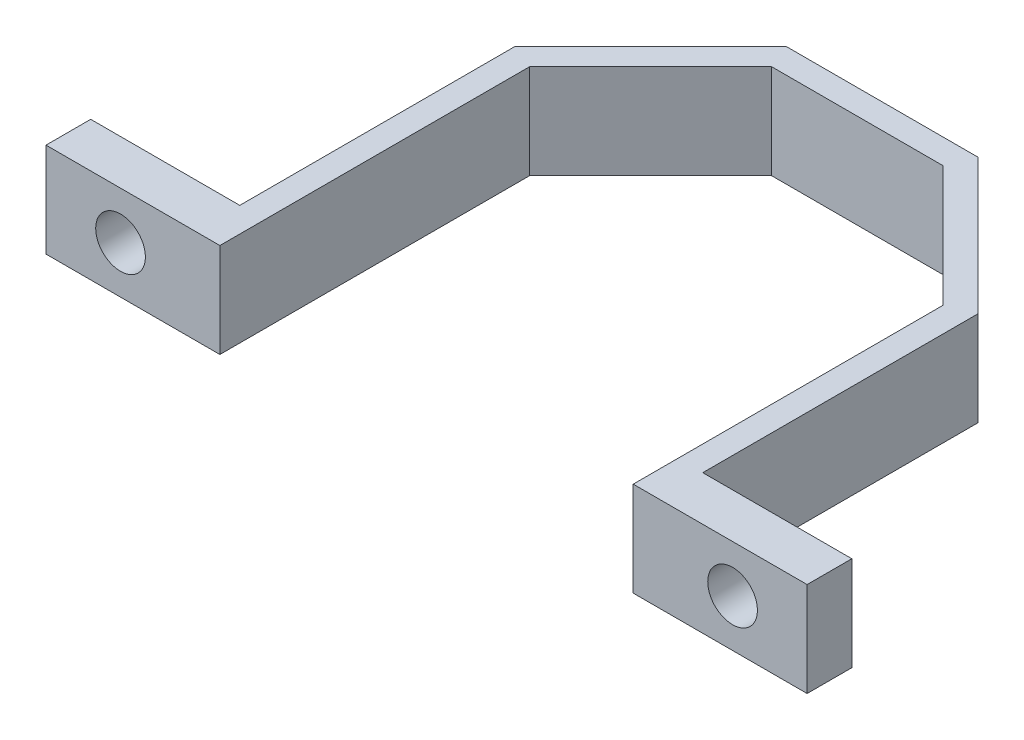
ISO-10303-21;
HEADER;
FILE_DESCRIPTION(('STEP AP214'),'2;1');
FILE_NAME('part.step','',(''),(''),'','','');
FILE_SCHEMA(('AUTOMOTIVE_DESIGN { 1 0 10303 214 1 1 1 1 }'));
ENDSEC;
DATA;
#1=APPLICATION_CONTEXT('core data for automotive mechanical design processes');
#2=APPLICATION_PROTOCOL_DEFINITION('international standard','automotive_design',2000,#1);
#3=PRODUCT_CONTEXT('',#1,'mechanical');
#4=PRODUCT('Part','Part','',(#3));
#5=PRODUCT_RELATED_PRODUCT_CATEGORY('part','',(#4));
#6=PRODUCT_DEFINITION_FORMATION('','',#4);
#7=PRODUCT_DEFINITION_CONTEXT('part definition',#1,'design');
#8=PRODUCT_DEFINITION('design','',#6,#7);
#9=PRODUCT_DEFINITION_SHAPE('','',#8);
#10=(LENGTH_UNIT() NAMED_UNIT(*) SI_UNIT(.MILLI.,.METRE.));
#11=(NAMED_UNIT(*) PLANE_ANGLE_UNIT() SI_UNIT($,.RADIAN.));
#12=(NAMED_UNIT(*) SI_UNIT($,.STERADIAN.) SOLID_ANGLE_UNIT());
#13=UNCERTAINTY_MEASURE_WITH_UNIT(LENGTH_MEASURE(1.E-05),#10,'distance_accuracy_value','');
#14=(GEOMETRIC_REPRESENTATION_CONTEXT(3) GLOBAL_UNCERTAINTY_ASSIGNED_CONTEXT((#13)) GLOBAL_UNIT_ASSIGNED_CONTEXT((#10,
#11,#12)) REPRESENTATION_CONTEXT('',''));
#15=CARTESIAN_POINT('',(0.,0.,0.));
#16=DIRECTION('',(0.,0.,1.));
#17=DIRECTION('',(1.,0.,0.));
#18=AXIS2_PLACEMENT_3D('',#15,#16,#17);
#19=CARTESIAN_POINT('',(9.65015405609134,9.5,-23.2975328012055));
#20=DIRECTION('',(0.,0.,1.));
#21=DIRECTION('',(1.,0.,0.));
#22=AXIS2_PLACEMENT_3D('',#19,#20,#21);
#23=PLANE('',#22);
#24=DIRECTION('',(-1.,0.,0.));
#25=VECTOR('',#24,1.);
#26=CARTESIAN_POINT('',(9.65015405609134,0.,-23.2975328012055));
#27=LINE('',#26,#25);
#28=CARTESIAN_POINT('',(9.65015405609134,0.,-23.2975328012055));
#29=VERTEX_POINT('',#28);
#30=CARTESIAN_POINT('',(-9.65015405609135,0.,-23.2975328012055));
#31=VERTEX_POINT('',#30);
#32=EDGE_CURVE('E178',#29,#31,#27,.T.);
#33=ORIENTED_EDGE('',*,*,#32,.T.);
#34=DIRECTION('',(0.,-1.,0.));
#35=VECTOR('',#34,1.);
#36=CARTESIAN_POINT('',(-9.65015405609135,9.5,-23.2975328012055));
#37=LINE('',#36,#35);
#38=CARTESIAN_POINT('',(-9.65015405609135,9.5,-23.2975328012055));
#39=VERTEX_POINT('',#38);
#40=EDGE_CURVE('E11',#39,#31,#37,.T.);
#41=ORIENTED_EDGE('',*,*,#40,.F.);
#42=DIRECTION('',(-1.,0.,0.));
#43=VECTOR('',#42,1.);
#44=CARTESIAN_POINT('',(9.65015405609134,9.5,-23.2975328012055));
#45=LINE('',#44,#43);
#46=CARTESIAN_POINT('',(9.65015405609134,9.5,-23.2975328012055));
#47=VERTEX_POINT('',#46);
#48=EDGE_CURVE('E213',#47,#39,#45,.T.);
#49=ORIENTED_EDGE('',*,*,#48,.F.);
#50=DIRECTION('',(0.,-1.,0.));
#51=VECTOR('',#50,1.);
#52=CARTESIAN_POINT('',(9.65015405609134,9.5,-23.2975328012055));
#53=LINE('',#52,#51);
#54=EDGE_CURVE('E174',#47,#29,#53,.T.);
#55=ORIENTED_EDGE('',*,*,#54,.T.);
#56=EDGE_LOOP('',(#33,#41,#49,#55));
#57=FACE_BOUND('',#56,.T.);
#58=ADVANCED_FACE('F33',(#57),#23,.F.);
#59=CARTESIAN_POINT('',(-9.65015405609135,9.5,-23.2975328012055));
#60=DIRECTION('',(0.707106781186548,0.,0.707106781186548));
#61=DIRECTION('',(0.707106781186548,0.,-0.707106781186548));
#62=AXIS2_PLACEMENT_3D('',#59,#60,#61);
#63=PLANE('',#62);
#64=DIRECTION('',(-0.707106781186547,0.,0.707106781186547));
#65=VECTOR('',#64,1.);
#66=CARTESIAN_POINT('',(-9.65015405609135,0.,-23.2975328012055));
#67=LINE('',#66,#65);
#68=CARTESIAN_POINT('',(-23.2975328012055,0.,-9.65015405609135));
#69=VERTEX_POINT('',#68);
#70=EDGE_CURVE('E181',#31,#69,#67,.T.);
#71=ORIENTED_EDGE('',*,*,#70,.T.);
#72=DIRECTION('',(0.,-1.,0.));
#73=VECTOR('',#72,1.);
#74=CARTESIAN_POINT('',(-23.2975328012055,9.5,-9.65015405609135));
#75=LINE('',#74,#73);
#76=CARTESIAN_POINT('',(-23.2975328012055,9.5,-9.65015405609135));
#77=VERTEX_POINT('',#76);
#78=EDGE_CURVE('E42',#77,#69,#75,.T.);
#79=ORIENTED_EDGE('',*,*,#78,.F.);
#80=DIRECTION('',(-0.707106781186547,0.,0.707106781186547));
#81=VECTOR('',#80,1.);
#82=CARTESIAN_POINT('',(-9.65015405609135,9.5,-23.2975328012055));
#83=LINE('',#82,#81);
#84=EDGE_CURVE('E116',#39,#77,#83,.T.);
#85=ORIENTED_EDGE('',*,*,#84,.F.);
#86=ORIENTED_EDGE('',*,*,#40,.T.);
#87=EDGE_LOOP('',(#71,#79,#85,#86));
#88=FACE_BOUND('',#87,.T.);
#89=ADVANCED_FACE('F253',(#88),#63,.F.);
#90=CARTESIAN_POINT('',(-23.2975328012055,9.5,9.65015405609134));
#91=DIRECTION('',(1.,0.,0.));
#92=DIRECTION('',(0.,0.,-1.));
#93=AXIS2_PLACEMENT_3D('',#90,#91,#92);
#94=PLANE('',#93);
#95=DIRECTION('',(0.,0.,1.));
#96=VECTOR('',#95,1.);
#97=CARTESIAN_POINT('',(-23.2975328012055,0.,9.65015405609134));
#98=LINE('',#97,#96);
#99=CARTESIAN_POINT('',(-23.2975328012055,0.,18.0475328060913));
#100=VERTEX_POINT('',#99);
#101=EDGE_CURVE('E184',#69,#100,#98,.T.);
#102=ORIENTED_EDGE('',*,*,#101,.T.);
#103=DIRECTION('',(0.,-1.,0.));
#104=VECTOR('',#103,1.);
#105=CARTESIAN_POINT('',(-23.2975328012055,9.5,18.0475328060913));
#106=LINE('',#105,#104);
#107=CARTESIAN_POINT('',(-23.2975328012055,9.5,18.0475328060913));
#108=VERTEX_POINT('',#107);
#109=EDGE_CURVE('E244',#108,#100,#106,.T.);
#110=ORIENTED_EDGE('',*,*,#109,.F.);
#111=DIRECTION('',(0.,0.,1.));
#112=VECTOR('',#111,1.);
#113=CARTESIAN_POINT('',(-23.2975328012055,9.5,-9.65015405609135));
#114=LINE('',#113,#112);
#115=EDGE_CURVE('E252',#77,#108,#114,.T.);
#116=ORIENTED_EDGE('',*,*,#115,.F.);
#117=ORIENTED_EDGE('',*,*,#78,.T.);
#118=EDGE_LOOP('',(#102,#110,#116,#117));
#119=FACE_BOUND('',#118,.T.);
#120=ADVANCED_FACE('F250',(#119),#94,.F.);
#121=CARTESIAN_POINT('',(-38.2975328012055,9.5,18.0475328060913));
#122=DIRECTION('',(0.,0.,1.));
#123=DIRECTION('',(1.,0.,0.));
#124=AXIS2_PLACEMENT_3D('',#121,#122,#123);
#125=PLANE('',#124);
#126=CARTESIAN_POINT('',(-30.7975328012055,4.75,18.0475328060913));
#127=DIRECTION('',(0.,0.,-1.));
#128=DIRECTION('',(-1.,0.,0.));
#129=AXIS2_PLACEMENT_3D('',#126,#127,#128);
#130=CIRCLE('',#129,2.5);
#131=CARTESIAN_POINT('',(-33.2975328012055,4.75,18.0475328060913));
#132=VERTEX_POINT('',#131);
#133=EDGE_CURVE('E501',#132,#132,#130,.T.);
#134=ORIENTED_EDGE('',*,*,#133,.F.);
#135=EDGE_LOOP('',(#134));
#136=FACE_BOUND('',#135,.T.);
#137=DIRECTION('',(-1.,0.,0.));
#138=VECTOR('',#137,1.);
#139=CARTESIAN_POINT('',(-38.2975328012055,0.,18.0475328060913));
#140=LINE('',#139,#138);
#141=CARTESIAN_POINT('',(-38.2975328012055,0.,18.0475328060913));
#142=VERTEX_POINT('',#141);
#143=EDGE_CURVE('E186',#100,#142,#140,.T.);
#144=ORIENTED_EDGE('',*,*,#143,.T.);
#145=DIRECTION('',(0.,-1.,0.));
#146=VECTOR('',#145,1.);
#147=CARTESIAN_POINT('',(-38.2975328012055,9.5,18.0475328060913));
#148=LINE('',#147,#146);
#149=CARTESIAN_POINT('',(-38.2975328012055,9.5,18.0475328060913));
#150=VERTEX_POINT('',#149);
#151=EDGE_CURVE('E241',#150,#142,#148,.T.);
#152=ORIENTED_EDGE('',*,*,#151,.F.);
#153=DIRECTION('',(-1.,0.,0.));
#154=VECTOR('',#153,1.);
#155=CARTESIAN_POINT('',(-38.2975328012055,9.5,18.0475328060913));
#156=LINE('',#155,#154);
#157=EDGE_CURVE('E271',#108,#150,#156,.T.);
#158=ORIENTED_EDGE('',*,*,#157,.F.);
#159=ORIENTED_EDGE('',*,*,#109,.T.);
#160=EDGE_LOOP('',(#144,#152,#158,#159));
#161=FACE_BOUND('',#160,.T.);
#162=ADVANCED_FACE('F262',(#136,#161),#125,.F.);
#163=CARTESIAN_POINT('',(-38.2975328012055,9.5,22.5475328060913));
#164=DIRECTION('',(1.,0.,0.));
#165=DIRECTION('',(0.,0.,-1.));
#166=AXIS2_PLACEMENT_3D('',#163,#164,#165);
#167=PLANE('',#166);
#168=DIRECTION('',(0.,0.,1.));
#169=VECTOR('',#168,1.);
#170=CARTESIAN_POINT('',(-38.2975328012055,0.,22.5475328060913));
#171=LINE('',#170,#169);
#172=CARTESIAN_POINT('',(-38.2975328012055,0.,22.5475328060913));
#173=VERTEX_POINT('',#172);
#174=EDGE_CURVE('E188',#142,#173,#171,.T.);
#175=ORIENTED_EDGE('',*,*,#174,.T.);
#176=DIRECTION('',(0.,-1.,0.));
#177=VECTOR('',#176,1.);
#178=CARTESIAN_POINT('',(-38.2975328012055,9.5,22.5475328060913));
#179=LINE('',#178,#177);
#180=CARTESIAN_POINT('',(-38.2975328012055,9.5,22.5475328060913));
#181=VERTEX_POINT('',#180);
#182=EDGE_CURVE('E238',#181,#173,#179,.T.);
#183=ORIENTED_EDGE('',*,*,#182,.F.);
#184=DIRECTION('',(0.,0.,1.));
#185=VECTOR('',#184,1.);
#186=CARTESIAN_POINT('',(-38.2975328012055,9.5,22.5475328060913));
#187=LINE('',#186,#185);
#188=EDGE_CURVE('E268',#150,#181,#187,.T.);
#189=ORIENTED_EDGE('',*,*,#188,.F.);
#190=ORIENTED_EDGE('',*,*,#151,.T.);
#191=EDGE_LOOP('',(#175,#183,#189,#190));
#192=FACE_BOUND('',#191,.T.);
#193=ADVANCED_FACE('F266',(#192),#167,.F.);
#194=CARTESIAN_POINT('',(-20.7975328012055,9.5,22.5475328060913));
#195=DIRECTION('',(0.,0.,-1.));
#196=DIRECTION('',(-1.,0.,0.));
#197=AXIS2_PLACEMENT_3D('',#194,#195,#196);
#198=PLANE('',#197);
#199=CARTESIAN_POINT('',(-30.7975328012055,4.75,22.5475328060913));
#200=DIRECTION('',(0.,0.,-1.));
#201=DIRECTION('',(-1.,0.,0.));
#202=AXIS2_PLACEMENT_3D('',#199,#200,#201);
#203=CIRCLE('',#202,2.5);
#204=CARTESIAN_POINT('',(-33.2975328012055,4.75,22.5475328060913));
#205=VERTEX_POINT('',#204);
#206=EDGE_CURVE('E36',#205,#205,#203,.T.);
#207=ORIENTED_EDGE('',*,*,#206,.T.);
#208=EDGE_LOOP('',(#207));
#209=FACE_BOUND('',#208,.T.);
#210=DIRECTION('',(1.,0.,0.));
#211=VECTOR('',#210,1.);
#212=CARTESIAN_POINT('',(-20.7975328012055,0.,22.5475328060913));
#213=LINE('',#212,#211);
#214=CARTESIAN_POINT('',(-20.7975328012055,0.,22.5475328060913));
#215=VERTEX_POINT('',#214);
#216=EDGE_CURVE('E191',#173,#215,#213,.T.);
#217=ORIENTED_EDGE('',*,*,#216,.T.);
#218=DIRECTION('',(0.,-1.,0.));
#219=VECTOR('',#218,1.);
#220=CARTESIAN_POINT('',(-20.7975328012055,9.5,22.5475328060913));
#221=LINE('',#220,#219);
#222=CARTESIAN_POINT('',(-20.7975328012055,9.5,22.5475328060913));
#223=VERTEX_POINT('',#222);
#224=EDGE_CURVE('E235',#223,#215,#221,.T.);
#225=ORIENTED_EDGE('',*,*,#224,.F.);
#226=DIRECTION('',(1.,0.,0.));
#227=VECTOR('',#226,1.);
#228=CARTESIAN_POINT('',(-23.2975328012055,9.5,22.5475328060913));
#229=LINE('',#228,#227);
#230=EDGE_CURVE('E270',#181,#223,#229,.T.);
#231=ORIENTED_EDGE('',*,*,#230,.F.);
#232=ORIENTED_EDGE('',*,*,#182,.T.);
#233=EDGE_LOOP('',(#217,#225,#231,#232));
#234=FACE_BOUND('',#233,.T.);
#235=ADVANCED_FACE('F320',(#209,#234),#198,.F.);
#236=CARTESIAN_POINT('',(-20.7975328012055,9.5,-8.61462015015861));
#237=DIRECTION('',(-1.,0.,0.));
#238=DIRECTION('',(0.,0.,1.));
#239=AXIS2_PLACEMENT_3D('',#236,#237,#238);
#240=PLANE('',#239);
#241=DIRECTION('',(0.,0.,-1.));
#242=VECTOR('',#241,1.);
#243=CARTESIAN_POINT('',(-20.7975328012055,0.,-8.61462015015861));
#244=LINE('',#243,#242);
#245=CARTESIAN_POINT('',(-20.7975328012055,0.,-8.61462015015861));
#246=VERTEX_POINT('',#245);
#247=EDGE_CURVE('E194',#215,#246,#244,.T.);
#248=ORIENTED_EDGE('',*,*,#247,.T.);
#249=DIRECTION('',(0.,-1.,0.));
#250=VECTOR('',#249,1.);
#251=CARTESIAN_POINT('',(-20.7975328012055,9.5,-8.61462015015861));
#252=LINE('',#251,#250);
#253=CARTESIAN_POINT('',(-20.7975328012055,9.5,-8.61462015015861));
#254=VERTEX_POINT('',#253);
#255=EDGE_CURVE('E232',#254,#246,#252,.T.);
#256=ORIENTED_EDGE('',*,*,#255,.F.);
#257=DIRECTION('',(0.,0.,-1.));
#258=VECTOR('',#257,1.);
#259=CARTESIAN_POINT('',(-20.7975328012055,9.5,12.1501540560913));
#260=LINE('',#259,#258);
#261=EDGE_CURVE('E273',#223,#254,#260,.T.);
#262=ORIENTED_EDGE('',*,*,#261,.F.);
#263=ORIENTED_EDGE('',*,*,#224,.T.);
#264=EDGE_LOOP('',(#248,#256,#262,#263));
#265=FACE_BOUND('',#264,.T.);
#266=ADVANCED_FACE('F317',(#265),#240,.F.);
#267=CARTESIAN_POINT('',(-8.61462015015861,9.5,-20.7975328012055));
#268=DIRECTION('',(-0.707106781186548,0.,-0.707106781186548));
#269=DIRECTION('',(-0.707106781186547,0.,0.707106781186548));
#270=AXIS2_PLACEMENT_3D('',#267,#268,#269);
#271=PLANE('',#270);
#272=DIRECTION('',(0.707106781186547,0.,-0.707106781186548));
#273=VECTOR('',#272,1.);
#274=CARTESIAN_POINT('',(-8.61462015015861,0.,-20.7975328012055));
#275=LINE('',#274,#273);
#276=CARTESIAN_POINT('',(-8.61462015015861,0.,-20.7975328012055));
#277=VERTEX_POINT('',#276);
#278=EDGE_CURVE('E196',#246,#277,#275,.T.);
#279=ORIENTED_EDGE('',*,*,#278,.T.);
#280=DIRECTION('',(0.,-1.,0.));
#281=VECTOR('',#280,1.);
#282=CARTESIAN_POINT('',(-8.61462015015861,9.5,-20.7975328012055));
#283=LINE('',#282,#281);
#284=CARTESIAN_POINT('',(-8.61462015015861,9.5,-20.7975328012055));
#285=VERTEX_POINT('',#284);
#286=EDGE_CURVE('E229',#285,#277,#283,.T.);
#287=ORIENTED_EDGE('',*,*,#286,.F.);
#288=DIRECTION('',(0.707106781186547,0.,-0.707106781186548));
#289=VECTOR('',#288,1.);
#290=CARTESIAN_POINT('',(-8.61462015015861,9.5,-20.7975328012055));
#291=LINE('',#290,#289);
#292=EDGE_CURVE('E279',#254,#285,#291,.T.);
#293=ORIENTED_EDGE('',*,*,#292,.F.);
#294=ORIENTED_EDGE('',*,*,#255,.T.);
#295=EDGE_LOOP('',(#279,#287,#293,#294));
#296=FACE_BOUND('',#295,.T.);
#297=ADVANCED_FACE('F313',(#296),#271,.F.);
#298=CARTESIAN_POINT('',(8.6146201501586,9.5,-20.7975328012055));
#299=DIRECTION('',(0.,0.,-1.));
#300=DIRECTION('',(-1.,0.,0.));
#301=AXIS2_PLACEMENT_3D('',#298,#299,#300);
#302=PLANE('',#301);
#303=DIRECTION('',(1.,0.,0.));
#304=VECTOR('',#303,1.);
#305=CARTESIAN_POINT('',(8.6146201501586,0.,-20.7975328012055));
#306=LINE('',#305,#304);
#307=CARTESIAN_POINT('',(8.6146201501586,0.,-20.7975328012055));
#308=VERTEX_POINT('',#307);
#309=EDGE_CURVE('E198',#277,#308,#306,.T.);
#310=ORIENTED_EDGE('',*,*,#309,.T.);
#311=DIRECTION('',(0.,-1.,0.));
#312=VECTOR('',#311,1.);
#313=CARTESIAN_POINT('',(8.6146201501586,9.5,-20.7975328012055));
#314=LINE('',#313,#312);
#315=CARTESIAN_POINT('',(8.6146201501586,9.5,-20.7975328012055));
#316=VERTEX_POINT('',#315);
#317=EDGE_CURVE('E226',#316,#308,#314,.T.);
#318=ORIENTED_EDGE('',*,*,#317,.F.);
#319=DIRECTION('',(1.,0.,0.));
#320=VECTOR('',#319,1.);
#321=CARTESIAN_POINT('',(8.6146201501586,9.5,-20.7975328012055));
#322=LINE('',#321,#320);
#323=EDGE_CURVE('E281',#285,#316,#322,.T.);
#324=ORIENTED_EDGE('',*,*,#323,.F.);
#325=ORIENTED_EDGE('',*,*,#286,.T.);
#326=EDGE_LOOP('',(#310,#318,#324,#325));
#327=FACE_BOUND('',#326,.T.);
#328=ADVANCED_FACE('F308',(#327),#302,.F.);
#329=CARTESIAN_POINT('',(20.7975328012055,9.5,-8.61462015015861));
#330=DIRECTION('',(0.707106781186548,0.,-0.707106781186548));
#331=DIRECTION('',(-0.707106781186548,0.,-0.707106781186548));
#332=AXIS2_PLACEMENT_3D('',#329,#330,#331);
#333=PLANE('',#332);
#334=DIRECTION('',(0.707106781186547,0.,0.707106781186547));
#335=VECTOR('',#334,1.);
#336=CARTESIAN_POINT('',(20.7975328012055,0.,-8.61462015015861));
#337=LINE('',#336,#335);
#338=CARTESIAN_POINT('',(20.7975328012055,0.,-8.61462015015861));
#339=VERTEX_POINT('',#338);
#340=EDGE_CURVE('E200',#308,#339,#337,.T.);
#341=ORIENTED_EDGE('',*,*,#340,.T.);
#342=DIRECTION('',(0.,-1.,0.));
#343=VECTOR('',#342,1.);
#344=CARTESIAN_POINT('',(20.7975328012055,9.5,-8.61462015015861));
#345=LINE('',#344,#343);
#346=CARTESIAN_POINT('',(20.7975328012055,9.5,-8.61462015015861));
#347=VERTEX_POINT('',#346);
#348=EDGE_CURVE('E223',#347,#339,#345,.T.);
#349=ORIENTED_EDGE('',*,*,#348,.F.);
#350=DIRECTION('',(0.707106781186547,0.,0.707106781186547));
#351=VECTOR('',#350,1.);
#352=CARTESIAN_POINT('',(20.7975328012055,9.5,-8.61462015015861));
#353=LINE('',#352,#351);
#354=EDGE_CURVE('E283',#316,#347,#353,.T.);
#355=ORIENTED_EDGE('',*,*,#354,.F.);
#356=ORIENTED_EDGE('',*,*,#317,.T.);
#357=EDGE_LOOP('',(#341,#349,#355,#356));
#358=FACE_BOUND('',#357,.T.);
#359=ADVANCED_FACE('F303',(#358),#333,.F.);
#360=CARTESIAN_POINT('',(20.7975328012055,9.5,12.1501540560913));
#361=DIRECTION('',(1.,0.,0.));
#362=DIRECTION('',(0.,0.,-1.));
#363=AXIS2_PLACEMENT_3D('',#360,#361,#362);
#364=PLANE('',#363);
#365=DIRECTION('',(0.,0.,1.));
#366=VECTOR('',#365,1.);
#367=CARTESIAN_POINT('',(20.7975328012055,0.,12.1501540560913));
#368=LINE('',#367,#366);
#369=CARTESIAN_POINT('',(20.7975328012055,0.,22.5475328060913));
#370=VERTEX_POINT('',#369);
#371=EDGE_CURVE('E203',#339,#370,#368,.T.);
#372=ORIENTED_EDGE('',*,*,#371,.T.);
#373=DIRECTION('',(0.,-1.,0.));
#374=VECTOR('',#373,1.);
#375=CARTESIAN_POINT('',(20.7975328012055,9.5,22.5475328060913));
#376=LINE('',#375,#374);
#377=CARTESIAN_POINT('',(20.7975328012055,9.5,22.5475328060913));
#378=VERTEX_POINT('',#377);
#379=EDGE_CURVE('E220',#378,#370,#376,.T.);
#380=ORIENTED_EDGE('',*,*,#379,.F.);
#381=DIRECTION('',(0.,0.,1.));
#382=VECTOR('',#381,1.);
#383=CARTESIAN_POINT('',(20.7975328012055,9.5,8.6146201501586));
#384=LINE('',#383,#382);
#385=EDGE_CURVE('E285',#347,#378,#384,.T.);
#386=ORIENTED_EDGE('',*,*,#385,.F.);
#387=ORIENTED_EDGE('',*,*,#348,.T.);
#388=EDGE_LOOP('',(#372,#380,#386,#387));
#389=FACE_BOUND('',#388,.T.);
#390=ADVANCED_FACE('F299',(#389),#364,.F.);
#391=CARTESIAN_POINT('',(23.2975328012054,9.5,22.5475328060913));
#392=DIRECTION('',(0.,0.,-1.));
#393=DIRECTION('',(-1.,0.,0.));
#394=AXIS2_PLACEMENT_3D('',#391,#392,#393);
#395=PLANE('',#394);
#396=CARTESIAN_POINT('',(30.7975328012055,4.75,22.5475328060913));
#397=DIRECTION('',(0.,0.,-1.));
#398=DIRECTION('',(-1.,0.,0.));
#399=AXIS2_PLACEMENT_3D('',#396,#397,#398);
#400=CIRCLE('',#399,2.5);
#401=CARTESIAN_POINT('',(28.2975328012055,4.75,22.5475328060913));
#402=VERTEX_POINT('',#401);
#403=EDGE_CURVE('E503',#402,#402,#400,.T.);
#404=ORIENTED_EDGE('',*,*,#403,.T.);
#405=EDGE_LOOP('',(#404));
#406=FACE_BOUND('',#405,.T.);
#407=DIRECTION('',(1.,0.,0.));
#408=VECTOR('',#407,1.);
#409=CARTESIAN_POINT('',(23.2975328012054,0.,22.5475328060913));
#410=LINE('',#409,#408);
#411=CARTESIAN_POINT('',(38.2975328012055,0.,22.5475328060913));
#412=VERTEX_POINT('',#411);
#413=EDGE_CURVE('E206',#370,#412,#410,.T.);
#414=ORIENTED_EDGE('',*,*,#413,.T.);
#415=DIRECTION('',(0.,-1.,0.));
#416=VECTOR('',#415,1.);
#417=CARTESIAN_POINT('',(38.2975328012055,9.5,22.5475328060913));
#418=LINE('',#417,#416);
#419=CARTESIAN_POINT('',(38.2975328012055,9.5,22.5475328060913));
#420=VERTEX_POINT('',#419);
#421=EDGE_CURVE('E217',#420,#412,#418,.T.);
#422=ORIENTED_EDGE('',*,*,#421,.F.);
#423=DIRECTION('',(1.,0.,0.));
#424=VECTOR('',#423,1.);
#425=CARTESIAN_POINT('',(20.7975328012055,9.5,22.5475328060913));
#426=LINE('',#425,#424);
#427=EDGE_CURVE('E287',#378,#420,#426,.T.);
#428=ORIENTED_EDGE('',*,*,#427,.F.);
#429=ORIENTED_EDGE('',*,*,#379,.T.);
#430=EDGE_LOOP('',(#414,#422,#428,#429));
#431=FACE_BOUND('',#430,.T.);
#432=ADVANCED_FACE('F293',(#406,#431),#395,.F.);
#433=CARTESIAN_POINT('',(38.2975328012055,9.5,22.5475328060913));
#434=DIRECTION('',(-1.,0.,0.));
#435=DIRECTION('',(0.,0.,1.));
#436=AXIS2_PLACEMENT_3D('',#433,#434,#435);
#437=PLANE('',#436);
#438=DIRECTION('',(0.,0.,-1.));
#439=VECTOR('',#438,1.);
#440=CARTESIAN_POINT('',(38.2975328012055,0.,22.5475328060913));
#441=LINE('',#440,#439);
#442=CARTESIAN_POINT('',(38.2975328012055,0.,18.0475328060913));
#443=VERTEX_POINT('',#442);
#444=EDGE_CURVE('E208',#412,#443,#441,.T.);
#445=ORIENTED_EDGE('',*,*,#444,.T.);
#446=DIRECTION('',(0.,-1.,0.));
#447=VECTOR('',#446,1.);
#448=CARTESIAN_POINT('',(38.2975328012055,9.5,18.0475328060913));
#449=LINE('',#448,#447);
#450=CARTESIAN_POINT('',(38.2975328012055,9.5,18.0475328060913));
#451=VERTEX_POINT('',#450);
#452=EDGE_CURVE('E169',#451,#443,#449,.T.);
#453=ORIENTED_EDGE('',*,*,#452,.F.);
#454=DIRECTION('',(0.,0.,-1.));
#455=VECTOR('',#454,1.);
#456=CARTESIAN_POINT('',(38.2975328012055,9.5,22.5475328060913));
#457=LINE('',#456,#455);
#458=EDGE_CURVE('E159',#420,#451,#457,.T.);
#459=ORIENTED_EDGE('',*,*,#458,.F.);
#460=ORIENTED_EDGE('',*,*,#421,.T.);
#461=EDGE_LOOP('',(#445,#453,#459,#460));
#462=FACE_BOUND('',#461,.T.);
#463=ADVANCED_FACE('F296',(#462),#437,.F.);
#464=CARTESIAN_POINT('',(38.2975328012055,9.5,18.0475328060913));
#465=DIRECTION('',(0.,0.,1.));
#466=DIRECTION('',(1.,0.,0.));
#467=AXIS2_PLACEMENT_3D('',#464,#465,#466);
#468=PLANE('',#467);
#469=CARTESIAN_POINT('',(30.7975328012055,4.75,18.0475328060913));
#470=DIRECTION('',(0.,0.,-1.));
#471=DIRECTION('',(-1.,0.,0.));
#472=AXIS2_PLACEMENT_3D('',#469,#470,#471);
#473=CIRCLE('',#472,2.5);
#474=CARTESIAN_POINT('',(28.2975328012055,4.75,18.0475328060913));
#475=VERTEX_POINT('',#474);
#476=EDGE_CURVE('E506',#475,#475,#473,.T.);
#477=ORIENTED_EDGE('',*,*,#476,.F.);
#478=EDGE_LOOP('',(#477));
#479=FACE_BOUND('',#478,.T.);
#480=DIRECTION('',(-1.,0.,0.));
#481=VECTOR('',#480,1.);
#482=CARTESIAN_POINT('',(38.2975328012055,0.,18.0475328060913));
#483=LINE('',#482,#481);
#484=CARTESIAN_POINT('',(23.2975328012054,0.,18.0475328060913));
#485=VERTEX_POINT('',#484);
#486=EDGE_CURVE('E168',#443,#485,#483,.T.);
#487=ORIENTED_EDGE('',*,*,#486,.T.);
#488=DIRECTION('',(0.,-1.,0.));
#489=VECTOR('',#488,1.);
#490=CARTESIAN_POINT('',(23.2975328012054,9.5,18.0475328060913));
#491=LINE('',#490,#489);
#492=CARTESIAN_POINT('',(23.2975328012054,9.5,18.0475328060913));
#493=VERTEX_POINT('',#492);
#494=EDGE_CURVE('E165',#493,#485,#491,.T.);
#495=ORIENTED_EDGE('',*,*,#494,.F.);
#496=DIRECTION('',(-1.,0.,0.));
#497=VECTOR('',#496,1.);
#498=CARTESIAN_POINT('',(38.2975328012055,9.5,18.0475328060913));
#499=LINE('',#498,#497);
#500=EDGE_CURVE('E153',#451,#493,#499,.T.);
#501=ORIENTED_EDGE('',*,*,#500,.F.);
#502=ORIENTED_EDGE('',*,*,#452,.T.);
#503=EDGE_LOOP('',(#487,#495,#501,#502));
#504=FACE_BOUND('',#503,.T.);
#505=ADVANCED_FACE('F166',(#479,#504),#468,.F.);
#506=CARTESIAN_POINT('',(23.2975328012055,9.5,9.65015405609134));
#507=DIRECTION('',(-1.,0.,0.));
#508=DIRECTION('',(0.,0.,1.));
#509=AXIS2_PLACEMENT_3D('',#506,#507,#508);
#510=PLANE('',#509);
#511=DIRECTION('',(0.,0.,-1.));
#512=VECTOR('',#511,1.);
#513=CARTESIAN_POINT('',(23.2975328012055,0.,9.65015405609134));
#514=LINE('',#513,#512);
#515=CARTESIAN_POINT('',(23.2975328012055,0.,-9.65015405609135));
#516=VERTEX_POINT('',#515);
#517=EDGE_CURVE('E102',#485,#516,#514,.T.);
#518=ORIENTED_EDGE('',*,*,#517,.T.);
#519=DIRECTION('',(0.,-1.,0.));
#520=VECTOR('',#519,1.);
#521=CARTESIAN_POINT('',(23.2975328012055,9.5,-9.65015405609135));
#522=LINE('',#521,#520);
#523=CARTESIAN_POINT('',(23.2975328012055,9.5,-9.65015405609135));
#524=VERTEX_POINT('',#523);
#525=EDGE_CURVE('E170',#524,#516,#522,.T.);
#526=ORIENTED_EDGE('',*,*,#525,.F.);
#527=DIRECTION('',(0.,0.,-1.));
#528=VECTOR('',#527,1.);
#529=CARTESIAN_POINT('',(23.2975328012055,9.5,9.65015405609134));
#530=LINE('',#529,#528);
#531=EDGE_CURVE('E157',#493,#524,#530,.T.);
#532=ORIENTED_EDGE('',*,*,#531,.F.);
#533=ORIENTED_EDGE('',*,*,#494,.T.);
#534=EDGE_LOOP('',(#518,#526,#532,#533));
#535=FACE_BOUND('',#534,.T.);
#536=ADVANCED_FACE('F172',(#535),#510,.F.);
#537=CARTESIAN_POINT('',(23.2975328012055,9.5,-9.65015405609135));
#538=DIRECTION('',(-0.707106781186547,0.,0.707106781186548));
#539=DIRECTION('',(0.707106781186548,0.,0.707106781186547));
#540=AXIS2_PLACEMENT_3D('',#537,#538,#539);
#541=PLANE('',#540);
#542=DIRECTION('',(-0.707106781186548,0.,-0.707106781186547));
#543=VECTOR('',#542,1.);
#544=CARTESIAN_POINT('',(23.2975328012055,0.,-9.65015405609135));
#545=LINE('',#544,#543);
#546=EDGE_CURVE('E108',#516,#29,#545,.T.);
#547=ORIENTED_EDGE('',*,*,#546,.T.);
#548=ORIENTED_EDGE('',*,*,#54,.F.);
#549=DIRECTION('',(-0.707106781186548,0.,-0.707106781186547));
#550=VECTOR('',#549,1.);
#551=CARTESIAN_POINT('',(23.2975328012055,9.5,-9.65015405609135));
#552=LINE('',#551,#550);
#553=EDGE_CURVE('E50',#524,#47,#552,.T.);
#554=ORIENTED_EDGE('',*,*,#553,.F.);
#555=ORIENTED_EDGE('',*,*,#525,.T.);
#556=EDGE_LOOP('',(#547,#548,#554,#555));
#557=FACE_BOUND('',#556,.T.);
#558=ADVANCED_FACE('F337',(#557),#541,.F.);
#559=CARTESIAN_POINT('',(0.,9.5,0.));
#560=DIRECTION('',(0.,1.,0.));
#561=DIRECTION('',(0.,0.,1.));
#562=AXIS2_PLACEMENT_3D('',#559,#560,#561);
#563=PLANE('',#562);
#564=ORIENTED_EDGE('',*,*,#48,.T.);
#565=ORIENTED_EDGE('',*,*,#84,.T.);
#566=ORIENTED_EDGE('',*,*,#115,.T.);
#567=ORIENTED_EDGE('',*,*,#157,.T.);
#568=ORIENTED_EDGE('',*,*,#188,.T.);
#569=ORIENTED_EDGE('',*,*,#230,.T.);
#570=ORIENTED_EDGE('',*,*,#261,.T.);
#571=ORIENTED_EDGE('',*,*,#292,.T.);
#572=ORIENTED_EDGE('',*,*,#323,.T.);
#573=ORIENTED_EDGE('',*,*,#354,.T.);
#574=ORIENTED_EDGE('',*,*,#385,.T.);
#575=ORIENTED_EDGE('',*,*,#427,.T.);
#576=ORIENTED_EDGE('',*,*,#458,.T.);
#577=ORIENTED_EDGE('',*,*,#500,.T.);
#578=ORIENTED_EDGE('',*,*,#531,.T.);
#579=ORIENTED_EDGE('',*,*,#553,.T.);
#580=EDGE_LOOP('',(#564,#565,#566,#567,#568,#569,#570,#571,#572,#573,#574,#575,#576,#577,#578,#579));
#581=FACE_BOUND('',#580,.T.);
#582=ADVANCED_FACE('F155',(#581),#563,.T.);
#583=CARTESIAN_POINT('',(0.,0.,0.));
#584=DIRECTION('',(0.,1.,0.));
#585=DIRECTION('',(0.,0.,1.));
#586=AXIS2_PLACEMENT_3D('',#583,#584,#585);
#587=PLANE('',#586);
#588=ORIENTED_EDGE('',*,*,#32,.F.);
#589=ORIENTED_EDGE('',*,*,#546,.F.);
#590=ORIENTED_EDGE('',*,*,#517,.F.);
#591=ORIENTED_EDGE('',*,*,#486,.F.);
#592=ORIENTED_EDGE('',*,*,#444,.F.);
#593=ORIENTED_EDGE('',*,*,#413,.F.);
#594=ORIENTED_EDGE('',*,*,#371,.F.);
#595=ORIENTED_EDGE('',*,*,#340,.F.);
#596=ORIENTED_EDGE('',*,*,#309,.F.);
#597=ORIENTED_EDGE('',*,*,#278,.F.);
#598=ORIENTED_EDGE('',*,*,#247,.F.);
#599=ORIENTED_EDGE('',*,*,#216,.F.);
#600=ORIENTED_EDGE('',*,*,#174,.F.);
#601=ORIENTED_EDGE('',*,*,#143,.F.);
#602=ORIENTED_EDGE('',*,*,#101,.F.);
#603=ORIENTED_EDGE('',*,*,#70,.F.);
#604=EDGE_LOOP('',(#588,#589,#590,#591,#592,#593,#594,#595,#596,#597,#598,#599,#600,#601,#602,#603));
#605=FACE_BOUND('',#604,.T.);
#606=ADVANCED_FACE('F257',(#605),#587,.F.);
#607=CARTESIAN_POINT('',(-30.7975328012055,4.75,27.5475328060913));
#608=DIRECTION('',(0.,0.,-1.));
#609=DIRECTION('',(-1.,0.,0.));
#610=AXIS2_PLACEMENT_3D('',#607,#608,#609);
#611=CYLINDRICAL_SURFACE('',#610,2.5);
#612=ORIENTED_EDGE('',*,*,#133,.T.);
#613=EDGE_LOOP('',(#612));
#614=FACE_BOUND('',#613,.T.);
#615=ORIENTED_EDGE('',*,*,#206,.F.);
#616=EDGE_LOOP('',(#615));
#617=FACE_BOUND('',#616,.T.);
#618=ADVANCED_FACE('F416',(#614,#617),#611,.F.);
#619=CARTESIAN_POINT('',(30.7975328012055,4.75,27.5475328060913));
#620=DIRECTION('',(0.,0.,-1.));
#621=DIRECTION('',(-1.,0.,0.));
#622=AXIS2_PLACEMENT_3D('',#619,#620,#621);
#623=CYLINDRICAL_SURFACE('',#622,2.5);
#624=ORIENTED_EDGE('',*,*,#476,.T.);
#625=EDGE_LOOP('',(#624));
#626=FACE_BOUND('',#625,.T.);
#627=ORIENTED_EDGE('',*,*,#403,.F.);
#628=EDGE_LOOP('',(#627));
#629=FACE_BOUND('',#628,.T.);
#630=ADVANCED_FACE('F514',(#626,#629),#623,.F.);
#631=CLOSED_SHELL('',(#58,#89,#120,#162,#193,#235,#266,#297,#328,#359,#390,#432,#463,#505,#536,
#558,#582,#606,#618,#630));
#632=MANIFOLD_SOLID_BREP('B2',#631);
#633=ADVANCED_BREP_SHAPE_REPRESENTATION('',(#18,#632),#14);
#634=SHAPE_DEFINITION_REPRESENTATION(#9,#633);
ENDSEC;
END-ISO-10303-21;
